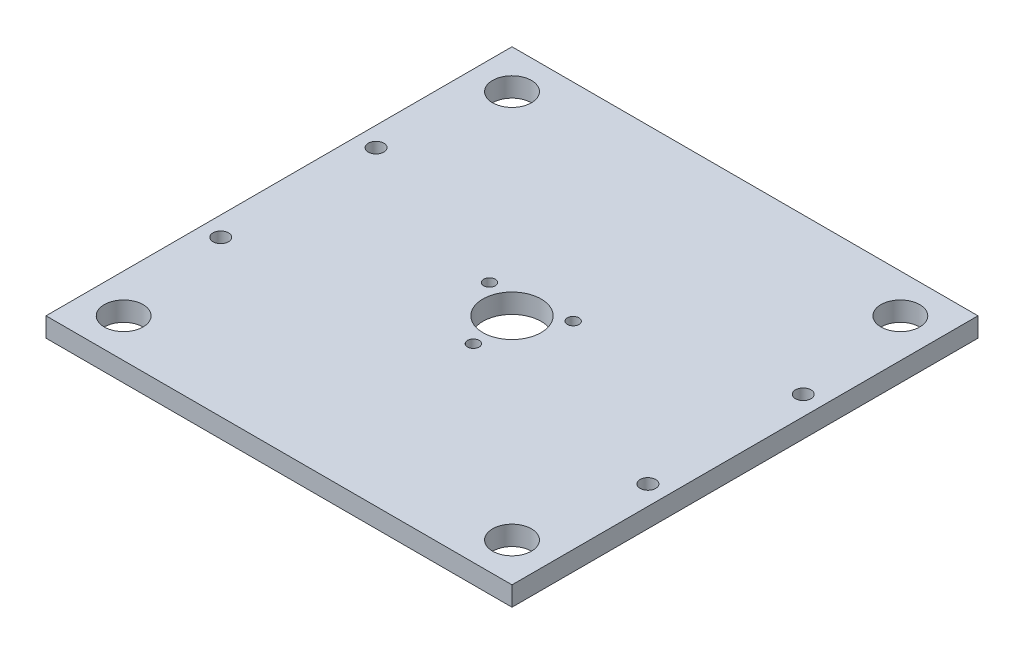
ISO-10303-21;
HEADER;
FILE_DESCRIPTION(('STEP AP214'),'2;1');
FILE_NAME('part.step','',(''),(''),'','','');
FILE_SCHEMA(('AUTOMOTIVE_DESIGN { 1 0 10303 214 1 1 1 1 }'));
ENDSEC;
DATA;
#1=APPLICATION_CONTEXT('core data for automotive mechanical design processes');
#2=APPLICATION_PROTOCOL_DEFINITION('international standard','automotive_design',2000,#1);
#3=PRODUCT_CONTEXT('',#1,'mechanical');
#4=PRODUCT('Part','Part','',(#3));
#5=PRODUCT_RELATED_PRODUCT_CATEGORY('part','',(#4));
#6=PRODUCT_DEFINITION_FORMATION('','',#4);
#7=PRODUCT_DEFINITION_CONTEXT('part definition',#1,'design');
#8=PRODUCT_DEFINITION('design','',#6,#7);
#9=PRODUCT_DEFINITION_SHAPE('','',#8);
#10=(LENGTH_UNIT() NAMED_UNIT(*) SI_UNIT(.MILLI.,.METRE.));
#11=(NAMED_UNIT(*) PLANE_ANGLE_UNIT() SI_UNIT($,.RADIAN.));
#12=(NAMED_UNIT(*) SI_UNIT($,.STERADIAN.) SOLID_ANGLE_UNIT());
#13=UNCERTAINTY_MEASURE_WITH_UNIT(LENGTH_MEASURE(1.E-05),#10,'distance_accuracy_value','');
#14=(GEOMETRIC_REPRESENTATION_CONTEXT(3) GLOBAL_UNCERTAINTY_ASSIGNED_CONTEXT((#13)) GLOBAL_UNIT_ASSIGNED_CONTEXT((#10,
#11,#12)) REPRESENTATION_CONTEXT('',''));
#15=CARTESIAN_POINT('',(0.,0.,0.));
#16=DIRECTION('',(0.,0.,1.));
#17=DIRECTION('',(1.,0.,0.));
#18=AXIS2_PLACEMENT_3D('',#15,#16,#17);
#19=CARTESIAN_POINT('',(0.,6.35,0.));
#20=DIRECTION('',(0.,1.,0.));
#21=DIRECTION('',(0.,0.,1.));
#22=AXIS2_PLACEMENT_3D('',#19,#20,#21);
#23=PLANE('',#22);
#24=CARTESIAN_POINT('',(69.85,6.35,-25.4));
#25=DIRECTION('',(0.,1.,0.));
#26=DIRECTION('',(0.,0.,1.));
#27=AXIS2_PLACEMENT_3D('',#24,#25,#26);
#28=CIRCLE('',#27,2.54);
#29=CARTESIAN_POINT('',(69.85,6.35,-22.86));
#30=VERTEX_POINT('',#29);
#31=EDGE_CURVE('E115',#30,#30,#28,.F.);
#32=ORIENTED_EDGE('',*,*,#31,.T.);
#33=EDGE_LOOP('',(#32));
#34=FACE_BOUND('',#33,.T.);
#35=CARTESIAN_POINT('',(69.85,6.35,25.4));
#36=DIRECTION('',(0.,-1.,0.));
#37=DIRECTION('',(0.,0.,-1.));
#38=AXIS2_PLACEMENT_3D('',#35,#36,#37);
#39=CIRCLE('',#38,2.54);
#40=CARTESIAN_POINT('',(69.85,6.35,22.86));
#41=VERTEX_POINT('',#40);
#42=EDGE_CURVE('E118',#41,#41,#39,.T.);
#43=ORIENTED_EDGE('',*,*,#42,.T.);
#44=EDGE_LOOP('',(#43));
#45=FACE_BOUND('',#44,.T.);
#46=CARTESIAN_POINT('',(-69.85,6.35,-25.4));
#47=DIRECTION('',(0.,-1.,0.));
#48=DIRECTION('',(0.,0.,-1.));
#49=AXIS2_PLACEMENT_3D('',#46,#47,#48);
#50=CIRCLE('',#49,2.54);
#51=CARTESIAN_POINT('',(-69.85,6.35,-27.94));
#52=VERTEX_POINT('',#51);
#53=EDGE_CURVE('E121',#52,#52,#50,.T.);
#54=ORIENTED_EDGE('',*,*,#53,.T.);
#55=EDGE_LOOP('',(#54));
#56=FACE_BOUND('',#55,.T.);
#57=CARTESIAN_POINT('',(-13.1120953434299,6.35,-5.73718467149221));
#58=DIRECTION('',(0.,1.,0.));
#59=DIRECTION('',(0.,0.,1.));
#60=AXIS2_PLACEMENT_3D('',#57,#58,#59);
#61=CIRCLE('',#60,1.89865);
#62=CARTESIAN_POINT('',(-13.1120953434299,6.35,-3.83853467149221));
#63=VERTEX_POINT('',#62);
#64=EDGE_CURVE('E124',#63,#63,#61,.F.);
#65=ORIENTED_EDGE('',*,*,#64,.T.);
#66=EDGE_LOOP('',(#65));
#67=FACE_BOUND('',#66,.T.);
#68=CARTESIAN_POINT('',(11.5245953434299,6.35,-8.4868153285078));
#69=DIRECTION('',(0.,1.,0.));
#70=DIRECTION('',(0.,0.,1.));
#71=AXIS2_PLACEMENT_3D('',#68,#69,#70);
#72=CIRCLE('',#71,1.89865);
#73=CARTESIAN_POINT('',(11.5245953434299,6.35,-6.5881653285078));
#74=VERTEX_POINT('',#73);
#75=EDGE_CURVE('E127',#74,#74,#72,.F.);
#76=ORIENTED_EDGE('',*,*,#75,.T.);
#77=EDGE_LOOP('',(#76));
#78=FACE_BOUND('',#77,.T.);
#79=CARTESIAN_POINT('',(1.5875,6.35,14.224));
#80=DIRECTION('',(0.,1.,0.));
#81=DIRECTION('',(0.,0.,1.));
#82=AXIS2_PLACEMENT_3D('',#79,#80,#81);
#83=CIRCLE('',#82,1.89865);
#84=CARTESIAN_POINT('',(1.5875,6.35,16.12265));
#85=VERTEX_POINT('',#84);
#86=EDGE_CURVE('E130',#85,#85,#83,.F.);
#87=ORIENTED_EDGE('',*,*,#86,.T.);
#88=EDGE_LOOP('',(#87));
#89=FACE_BOUND('',#88,.T.);
#90=CARTESIAN_POINT('',(-69.85,6.35,25.4));
#91=DIRECTION('',(0.,1.,0.));
#92=DIRECTION('',(0.,0.,1.));
#93=AXIS2_PLACEMENT_3D('',#90,#91,#92);
#94=CIRCLE('',#93,2.54);
#95=CARTESIAN_POINT('',(-69.85,6.35,27.94));
#96=VERTEX_POINT('',#95);
#97=EDGE_CURVE('E133',#96,#96,#94,.F.);
#98=ORIENTED_EDGE('',*,*,#97,.T.);
#99=EDGE_LOOP('',(#98));
#100=FACE_BOUND('',#99,.T.);
#101=CARTESIAN_POINT('',(0.,6.35,0.));
#102=DIRECTION('',(0.,1.,0.));
#103=DIRECTION('',(0.,0.,1.));
#104=AXIS2_PLACEMENT_3D('',#101,#102,#103);
#105=CIRCLE('',#104,9.525);
#106=CARTESIAN_POINT('',(0.,6.35,9.525));
#107=VERTEX_POINT('',#106);
#108=EDGE_CURVE('E136',#107,#107,#105,.F.);
#109=ORIENTED_EDGE('',*,*,#108,.T.);
#110=EDGE_LOOP('',(#109));
#111=FACE_BOUND('',#110,.T.);
#112=CARTESIAN_POINT('',(63.5,6.35,-63.5));
#113=DIRECTION('',(0.,1.,0.));
#114=DIRECTION('',(0.,0.,1.));
#115=AXIS2_PLACEMENT_3D('',#112,#113,#114);
#116=CIRCLE('',#115,6.35);
#117=CARTESIAN_POINT('',(63.5,6.35,-57.15));
#118=VERTEX_POINT('',#117);
#119=EDGE_CURVE('E139',#118,#118,#116,.F.);
#120=ORIENTED_EDGE('',*,*,#119,.T.);
#121=EDGE_LOOP('',(#120));
#122=FACE_BOUND('',#121,.T.);
#123=CARTESIAN_POINT('',(63.5,6.35,63.5));
#124=DIRECTION('',(0.,1.,0.));
#125=DIRECTION('',(0.,0.,1.));
#126=AXIS2_PLACEMENT_3D('',#123,#124,#125);
#127=CIRCLE('',#126,6.35);
#128=CARTESIAN_POINT('',(63.5,6.35,69.85));
#129=VERTEX_POINT('',#128);
#130=EDGE_CURVE('E142',#129,#129,#127,.F.);
#131=ORIENTED_EDGE('',*,*,#130,.T.);
#132=EDGE_LOOP('',(#131));
#133=FACE_BOUND('',#132,.T.);
#134=CARTESIAN_POINT('',(-63.5,6.35,63.5));
#135=DIRECTION('',(0.,1.,0.));
#136=DIRECTION('',(0.,0.,1.));
#137=AXIS2_PLACEMENT_3D('',#134,#135,#136);
#138=CIRCLE('',#137,6.35);
#139=CARTESIAN_POINT('',(-63.5,6.35,69.85));
#140=VERTEX_POINT('',#139);
#141=EDGE_CURVE('E144',#140,#140,#138,.F.);
#142=ORIENTED_EDGE('',*,*,#141,.T.);
#143=EDGE_LOOP('',(#142));
#144=FACE_BOUND('',#143,.T.);
#145=CARTESIAN_POINT('',(-63.5,6.35,-63.5));
#146=DIRECTION('',(0.,1.,0.));
#147=DIRECTION('',(0.,0.,1.));
#148=AXIS2_PLACEMENT_3D('',#145,#146,#147);
#149=CIRCLE('',#148,6.35);
#150=CARTESIAN_POINT('',(-63.5,6.35,-57.15));
#151=VERTEX_POINT('',#150);
#152=EDGE_CURVE('E19',#151,#151,#149,.F.);
#153=ORIENTED_EDGE('',*,*,#152,.T.);
#154=EDGE_LOOP('',(#153));
#155=FACE_BOUND('',#154,.T.);
#156=DIRECTION('',(-1.,0.,0.));
#157=VECTOR('',#156,1.);
#158=CARTESIAN_POINT('',(76.2,6.35,-76.2));
#159=LINE('',#158,#157);
#160=CARTESIAN_POINT('',(-76.2,6.35,-76.2));
#161=VERTEX_POINT('',#160);
#162=CARTESIAN_POINT('',(76.2,6.35,-76.2));
#163=VERTEX_POINT('',#162);
#164=EDGE_CURVE('E70',#161,#163,#159,.F.);
#165=ORIENTED_EDGE('',*,*,#164,.F.);
#166=DIRECTION('',(0.,0.,1.));
#167=VECTOR('',#166,1.);
#168=CARTESIAN_POINT('',(-76.2,6.35,-76.2));
#169=LINE('',#168,#167);
#170=CARTESIAN_POINT('',(-76.2,6.35,76.2));
#171=VERTEX_POINT('',#170);
#172=EDGE_CURVE('E67',#171,#161,#169,.F.);
#173=ORIENTED_EDGE('',*,*,#172,.F.);
#174=DIRECTION('',(1.,0.,0.));
#175=VECTOR('',#174,1.);
#176=CARTESIAN_POINT('',(-76.2,6.35,76.2));
#177=LINE('',#176,#175);
#178=CARTESIAN_POINT('',(76.2,6.35,76.2));
#179=VERTEX_POINT('',#178);
#180=EDGE_CURVE('E58',#179,#171,#177,.F.);
#181=ORIENTED_EDGE('',*,*,#180,.F.);
#182=DIRECTION('',(0.,0.,-1.));
#183=VECTOR('',#182,1.);
#184=CARTESIAN_POINT('',(76.2,6.35,76.2));
#185=LINE('',#184,#183);
#186=EDGE_CURVE('E53',#163,#179,#185,.F.);
#187=ORIENTED_EDGE('',*,*,#186,.F.);
#188=EDGE_LOOP('',(#165,#173,#181,#187));
#189=FACE_BOUND('',#188,.T.);
#190=ADVANCED_FACE('F16',(#34,#45,#56,#67,#78,#89,#100,#111,#122,#133,#144,#155,#189),#23,.T.);
#191=CARTESIAN_POINT('',(-76.2,0.,-76.2));
#192=DIRECTION('',(-1.,0.,0.));
#193=DIRECTION('',(0.,0.,1.));
#194=AXIS2_PLACEMENT_3D('',#191,#192,#193);
#195=PLANE('',#194);
#196=DIRECTION('',(0.,1.,0.));
#197=VECTOR('',#196,1.);
#198=CARTESIAN_POINT('',(-76.2,0.,-76.2));
#199=LINE('',#198,#197);
#200=CARTESIAN_POINT('',(-76.2,0.,-76.2));
#201=VERTEX_POINT('',#200);
#202=EDGE_CURVE('E152',#201,#161,#199,.T.);
#203=ORIENTED_EDGE('',*,*,#202,.F.);
#204=DIRECTION('',(0.,0.,1.));
#205=VECTOR('',#204,1.);
#206=CARTESIAN_POINT('',(-76.2,0.,0.));
#207=LINE('',#206,#205);
#208=CARTESIAN_POINT('',(-76.2,0.,76.2));
#209=VERTEX_POINT('',#208);
#210=EDGE_CURVE('E77',#201,#209,#207,.T.);
#211=ORIENTED_EDGE('',*,*,#210,.T.);
#212=DIRECTION('',(0.,1.,0.));
#213=VECTOR('',#212,1.);
#214=CARTESIAN_POINT('',(-76.2,0.,76.2));
#215=LINE('',#214,#213);
#216=EDGE_CURVE('E63',#171,#209,#215,.F.);
#217=ORIENTED_EDGE('',*,*,#216,.F.);
#218=ORIENTED_EDGE('',*,*,#172,.T.);
#219=EDGE_LOOP('',(#203,#211,#217,#218));
#220=FACE_BOUND('',#219,.T.);
#221=ADVANCED_FACE('F76',(#220),#195,.T.);
#222=CARTESIAN_POINT('',(-76.2,0.,76.2));
#223=DIRECTION('',(0.,0.,1.));
#224=DIRECTION('',(1.,0.,0.));
#225=AXIS2_PLACEMENT_3D('',#222,#223,#224);
#226=PLANE('',#225);
#227=ORIENTED_EDGE('',*,*,#216,.T.);
#228=DIRECTION('',(1.,0.,0.));
#229=VECTOR('',#228,1.);
#230=CARTESIAN_POINT('',(0.,0.,76.2));
#231=LINE('',#230,#229);
#232=CARTESIAN_POINT('',(76.2,0.,76.2));
#233=VERTEX_POINT('',#232);
#234=EDGE_CURVE('E163',#209,#233,#231,.T.);
#235=ORIENTED_EDGE('',*,*,#234,.T.);
#236=DIRECTION('',(0.,1.,0.));
#237=VECTOR('',#236,1.);
#238=CARTESIAN_POINT('',(76.2,0.,76.2));
#239=LINE('',#238,#237);
#240=EDGE_CURVE('E65',#179,#233,#239,.F.);
#241=ORIENTED_EDGE('',*,*,#240,.F.);
#242=ORIENTED_EDGE('',*,*,#180,.T.);
#243=EDGE_LOOP('',(#227,#235,#241,#242));
#244=FACE_BOUND('',#243,.T.);
#245=ADVANCED_FACE('F60',(#244),#226,.T.);
#246=CARTESIAN_POINT('',(76.2,0.,76.2));
#247=DIRECTION('',(1.,0.,0.));
#248=DIRECTION('',(0.,0.,-1.));
#249=AXIS2_PLACEMENT_3D('',#246,#247,#248);
#250=PLANE('',#249);
#251=ORIENTED_EDGE('',*,*,#240,.T.);
#252=DIRECTION('',(0.,0.,1.));
#253=VECTOR('',#252,1.);
#254=CARTESIAN_POINT('',(76.2,0.,0.));
#255=LINE('',#254,#253);
#256=CARTESIAN_POINT('',(76.2,0.,-76.2));
#257=VERTEX_POINT('',#256);
#258=EDGE_CURVE('E160',#233,#257,#255,.F.);
#259=ORIENTED_EDGE('',*,*,#258,.T.);
#260=DIRECTION('',(0.,1.,0.));
#261=VECTOR('',#260,1.);
#262=CARTESIAN_POINT('',(76.2,0.,-76.2));
#263=LINE('',#262,#261);
#264=EDGE_CURVE('E34',#163,#257,#263,.F.);
#265=ORIENTED_EDGE('',*,*,#264,.F.);
#266=ORIENTED_EDGE('',*,*,#186,.T.);
#267=EDGE_LOOP('',(#251,#259,#265,#266));
#268=FACE_BOUND('',#267,.T.);
#269=ADVANCED_FACE('F159',(#268),#250,.T.);
#270=CARTESIAN_POINT('',(76.2,0.,-76.2));
#271=DIRECTION('',(0.,0.,-1.));
#272=DIRECTION('',(-1.,0.,0.));
#273=AXIS2_PLACEMENT_3D('',#270,#271,#272);
#274=PLANE('',#273);
#275=ORIENTED_EDGE('',*,*,#264,.T.);
#276=DIRECTION('',(1.,0.,0.));
#277=VECTOR('',#276,1.);
#278=CARTESIAN_POINT('',(0.,0.,-76.2));
#279=LINE('',#278,#277);
#280=EDGE_CURVE('E114',#257,#201,#279,.F.);
#281=ORIENTED_EDGE('',*,*,#280,.T.);
#282=ORIENTED_EDGE('',*,*,#202,.T.);
#283=ORIENTED_EDGE('',*,*,#164,.T.);
#284=EDGE_LOOP('',(#275,#281,#282,#283));
#285=FACE_BOUND('',#284,.T.);
#286=ADVANCED_FACE('F166',(#285),#274,.T.);
#287=CARTESIAN_POINT('',(-63.5,6.35,-63.5));
#288=DIRECTION('',(0.,1.,0.));
#289=DIRECTION('',(0.,0.,1.));
#290=AXIS2_PLACEMENT_3D('',#287,#288,#289);
#291=CYLINDRICAL_SURFACE('',#290,6.35);
#292=ORIENTED_EDGE('',*,*,#152,.F.);
#293=EDGE_LOOP('',(#292));
#294=FACE_BOUND('',#293,.T.);
#295=CARTESIAN_POINT('',(-63.5,0.,-63.5));
#296=DIRECTION('',(0.,1.,0.));
#297=DIRECTION('',(0.,0.,1.));
#298=AXIS2_PLACEMENT_3D('',#295,#296,#297);
#299=CIRCLE('',#298,6.35);
#300=CARTESIAN_POINT('',(-63.5,0.,-57.15));
#301=VERTEX_POINT('',#300);
#302=EDGE_CURVE('E111',#301,#301,#299,.F.);
#303=ORIENTED_EDGE('',*,*,#302,.T.);
#304=EDGE_LOOP('',(#303));
#305=FACE_BOUND('',#304,.T.);
#306=ADVANCED_FACE('F168',(#294,#305),#291,.F.);
#307=CARTESIAN_POINT('',(-63.5,6.35,63.5));
#308=DIRECTION('',(0.,1.,0.));
#309=DIRECTION('',(0.,0.,1.));
#310=AXIS2_PLACEMENT_3D('',#307,#308,#309);
#311=CYLINDRICAL_SURFACE('',#310,6.35);
#312=ORIENTED_EDGE('',*,*,#141,.F.);
#313=EDGE_LOOP('',(#312));
#314=FACE_BOUND('',#313,.T.);
#315=CARTESIAN_POINT('',(-63.5,0.,63.5));
#316=DIRECTION('',(0.,1.,0.));
#317=DIRECTION('',(0.,0.,1.));
#318=AXIS2_PLACEMENT_3D('',#315,#316,#317);
#319=CIRCLE('',#318,6.35);
#320=CARTESIAN_POINT('',(-63.5,0.,69.85));
#321=VERTEX_POINT('',#320);
#322=EDGE_CURVE('E108',#321,#321,#319,.F.);
#323=ORIENTED_EDGE('',*,*,#322,.T.);
#324=EDGE_LOOP('',(#323));
#325=FACE_BOUND('',#324,.T.);
#326=ADVANCED_FACE('F175',(#314,#325),#311,.F.);
#327=CARTESIAN_POINT('',(63.5,6.35,63.5));
#328=DIRECTION('',(0.,1.,0.));
#329=DIRECTION('',(0.,0.,1.));
#330=AXIS2_PLACEMENT_3D('',#327,#328,#329);
#331=CYLINDRICAL_SURFACE('',#330,6.35);
#332=ORIENTED_EDGE('',*,*,#130,.F.);
#333=EDGE_LOOP('',(#332));
#334=FACE_BOUND('',#333,.T.);
#335=CARTESIAN_POINT('',(63.5,0.,63.5));
#336=DIRECTION('',(0.,1.,0.));
#337=DIRECTION('',(0.,0.,1.));
#338=AXIS2_PLACEMENT_3D('',#335,#336,#337);
#339=CIRCLE('',#338,6.35);
#340=CARTESIAN_POINT('',(63.5,0.,69.85));
#341=VERTEX_POINT('',#340);
#342=EDGE_CURVE('E105',#341,#341,#339,.F.);
#343=ORIENTED_EDGE('',*,*,#342,.T.);
#344=EDGE_LOOP('',(#343));
#345=FACE_BOUND('',#344,.T.);
#346=ADVANCED_FACE('F222',(#334,#345),#331,.F.);
#347=CARTESIAN_POINT('',(63.5,6.35,-63.5));
#348=DIRECTION('',(0.,1.,0.));
#349=DIRECTION('',(0.,0.,1.));
#350=AXIS2_PLACEMENT_3D('',#347,#348,#349);
#351=CYLINDRICAL_SURFACE('',#350,6.35);
#352=ORIENTED_EDGE('',*,*,#119,.F.);
#353=EDGE_LOOP('',(#352));
#354=FACE_BOUND('',#353,.T.);
#355=CARTESIAN_POINT('',(63.5,0.,-63.5));
#356=DIRECTION('',(0.,1.,0.));
#357=DIRECTION('',(0.,0.,1.));
#358=AXIS2_PLACEMENT_3D('',#355,#356,#357);
#359=CIRCLE('',#358,6.35);
#360=CARTESIAN_POINT('',(63.5,0.,-57.15));
#361=VERTEX_POINT('',#360);
#362=EDGE_CURVE('E102',#361,#361,#359,.F.);
#363=ORIENTED_EDGE('',*,*,#362,.T.);
#364=EDGE_LOOP('',(#363));
#365=FACE_BOUND('',#364,.T.);
#366=ADVANCED_FACE('F218',(#354,#365),#351,.F.);
#367=CARTESIAN_POINT('',(0.,6.35,0.));
#368=DIRECTION('',(0.,1.,0.));
#369=DIRECTION('',(0.,0.,1.));
#370=AXIS2_PLACEMENT_3D('',#367,#368,#369);
#371=CYLINDRICAL_SURFACE('',#370,9.525);
#372=ORIENTED_EDGE('',*,*,#108,.F.);
#373=EDGE_LOOP('',(#372));
#374=FACE_BOUND('',#373,.T.);
#375=CARTESIAN_POINT('',(0.,0.,0.));
#376=DIRECTION('',(0.,1.,0.));
#377=DIRECTION('',(0.,0.,1.));
#378=AXIS2_PLACEMENT_3D('',#375,#376,#377);
#379=CIRCLE('',#378,9.525);
#380=CARTESIAN_POINT('',(0.,0.,9.525));
#381=VERTEX_POINT('',#380);
#382=EDGE_CURVE('E99',#381,#381,#379,.F.);
#383=ORIENTED_EDGE('',*,*,#382,.T.);
#384=EDGE_LOOP('',(#383));
#385=FACE_BOUND('',#384,.T.);
#386=ADVANCED_FACE('F214',(#374,#385),#371,.F.);
#387=CARTESIAN_POINT('',(-69.85,0.,25.4));
#388=DIRECTION('',(0.,1.,0.));
#389=DIRECTION('',(0.,0.,1.));
#390=AXIS2_PLACEMENT_3D('',#387,#388,#389);
#391=CYLINDRICAL_SURFACE('',#390,2.54);
#392=ORIENTED_EDGE('',*,*,#97,.F.);
#393=EDGE_LOOP('',(#392));
#394=FACE_BOUND('',#393,.T.);
#395=CARTESIAN_POINT('',(-69.85,0.,25.4));
#396=DIRECTION('',(0.,1.,0.));
#397=DIRECTION('',(0.,0.,1.));
#398=AXIS2_PLACEMENT_3D('',#395,#396,#397);
#399=CIRCLE('',#398,2.54);
#400=CARTESIAN_POINT('',(-69.85,0.,27.94));
#401=VERTEX_POINT('',#400);
#402=EDGE_CURVE('E96',#401,#401,#399,.F.);
#403=ORIENTED_EDGE('',*,*,#402,.T.);
#404=EDGE_LOOP('',(#403));
#405=FACE_BOUND('',#404,.T.);
#406=ADVANCED_FACE('F210',(#394,#405),#391,.F.);
#407=CARTESIAN_POINT('',(1.5875,-0.98425,14.224));
#408=DIRECTION('',(0.,1.,0.));
#409=DIRECTION('',(0.,0.,1.));
#410=AXIS2_PLACEMENT_3D('',#407,#408,#409);
#411=CYLINDRICAL_SURFACE('',#410,1.89865);
#412=ORIENTED_EDGE('',*,*,#86,.F.);
#413=EDGE_LOOP('',(#412));
#414=FACE_BOUND('',#413,.T.);
#415=CARTESIAN_POINT('',(1.5875,0.,14.224));
#416=DIRECTION('',(0.,1.,0.));
#417=DIRECTION('',(0.,0.,1.));
#418=AXIS2_PLACEMENT_3D('',#415,#416,#417);
#419=CIRCLE('',#418,1.89865);
#420=CARTESIAN_POINT('',(1.5875,0.,16.12265));
#421=VERTEX_POINT('',#420);
#422=EDGE_CURVE('E93',#421,#421,#419,.F.);
#423=ORIENTED_EDGE('',*,*,#422,.T.);
#424=EDGE_LOOP('',(#423));
#425=FACE_BOUND('',#424,.T.);
#426=ADVANCED_FACE('F206',(#414,#425),#411,.F.);
#427=CARTESIAN_POINT('',(11.5245953434299,-0.984250000000002,-8.4868153285078));
#428=DIRECTION('',(0.,1.,0.));
#429=DIRECTION('',(0.,0.,1.));
#430=AXIS2_PLACEMENT_3D('',#427,#428,#429);
#431=CYLINDRICAL_SURFACE('',#430,1.89865);
#432=ORIENTED_EDGE('',*,*,#75,.F.);
#433=EDGE_LOOP('',(#432));
#434=FACE_BOUND('',#433,.T.);
#435=CARTESIAN_POINT('',(11.5245953434299,0.,-8.4868153285078));
#436=DIRECTION('',(0.,1.,0.));
#437=DIRECTION('',(0.,0.,1.));
#438=AXIS2_PLACEMENT_3D('',#435,#436,#437);
#439=CIRCLE('',#438,1.89865);
#440=CARTESIAN_POINT('',(11.5245953434299,0.,-6.5881653285078));
#441=VERTEX_POINT('',#440);
#442=EDGE_CURVE('E90',#441,#441,#439,.F.);
#443=ORIENTED_EDGE('',*,*,#442,.T.);
#444=EDGE_LOOP('',(#443));
#445=FACE_BOUND('',#444,.T.);
#446=ADVANCED_FACE('F202',(#434,#445),#431,.F.);
#447=CARTESIAN_POINT('',(-13.1120953434299,-0.98425,-5.73718467149221));
#448=DIRECTION('',(0.,1.,0.));
#449=DIRECTION('',(0.,0.,1.));
#450=AXIS2_PLACEMENT_3D('',#447,#448,#449);
#451=CYLINDRICAL_SURFACE('',#450,1.89865);
#452=ORIENTED_EDGE('',*,*,#64,.F.);
#453=EDGE_LOOP('',(#452));
#454=FACE_BOUND('',#453,.T.);
#455=CARTESIAN_POINT('',(-13.1120953434299,0.,-5.73718467149221));
#456=DIRECTION('',(0.,1.,0.));
#457=DIRECTION('',(0.,0.,1.));
#458=AXIS2_PLACEMENT_3D('',#455,#456,#457);
#459=CIRCLE('',#458,1.89865);
#460=CARTESIAN_POINT('',(-13.1120953434299,0.,-3.83853467149221));
#461=VERTEX_POINT('',#460);
#462=EDGE_CURVE('E87',#461,#461,#459,.F.);
#463=ORIENTED_EDGE('',*,*,#462,.T.);
#464=EDGE_LOOP('',(#463));
#465=FACE_BOUND('',#464,.T.);
#466=ADVANCED_FACE('F198',(#454,#465),#451,.F.);
#467=CARTESIAN_POINT('',(-69.85,0.,-25.4));
#468=DIRECTION('',(0.,-1.,0.));
#469=DIRECTION('',(0.,0.,-1.));
#470=AXIS2_PLACEMENT_3D('',#467,#468,#469);
#471=CYLINDRICAL_SURFACE('',#470,2.54);
#472=CARTESIAN_POINT('',(-69.85,0.,-25.4));
#473=DIRECTION('',(0.,-1.,0.));
#474=DIRECTION('',(0.,0.,-1.));
#475=AXIS2_PLACEMENT_3D('',#472,#473,#474);
#476=CIRCLE('',#475,2.54);
#477=CARTESIAN_POINT('',(-69.85,0.,-27.94));
#478=VERTEX_POINT('',#477);
#479=EDGE_CURVE('E84',#478,#478,#476,.T.);
#480=ORIENTED_EDGE('',*,*,#479,.T.);
#481=EDGE_LOOP('',(#480));
#482=FACE_BOUND('',#481,.T.);
#483=ORIENTED_EDGE('',*,*,#53,.F.);
#484=EDGE_LOOP('',(#483));
#485=FACE_BOUND('',#484,.T.);
#486=ADVANCED_FACE('F194',(#482,#485),#471,.F.);
#487=CARTESIAN_POINT('',(69.85,0.,25.4));
#488=DIRECTION('',(0.,-1.,0.));
#489=DIRECTION('',(0.,0.,-1.));
#490=AXIS2_PLACEMENT_3D('',#487,#488,#489);
#491=CYLINDRICAL_SURFACE('',#490,2.54);
#492=CARTESIAN_POINT('',(69.85,0.,25.4));
#493=DIRECTION('',(0.,-1.,0.));
#494=DIRECTION('',(0.,0.,-1.));
#495=AXIS2_PLACEMENT_3D('',#492,#493,#494);
#496=CIRCLE('',#495,2.54);
#497=CARTESIAN_POINT('',(69.85,0.,22.86));
#498=VERTEX_POINT('',#497);
#499=EDGE_CURVE('E25',#498,#498,#496,.T.);
#500=ORIENTED_EDGE('',*,*,#499,.T.);
#501=EDGE_LOOP('',(#500));
#502=FACE_BOUND('',#501,.T.);
#503=ORIENTED_EDGE('',*,*,#42,.F.);
#504=EDGE_LOOP('',(#503));
#505=FACE_BOUND('',#504,.T.);
#506=ADVANCED_FACE('F186',(#502,#505),#491,.F.);
#507=CARTESIAN_POINT('',(69.85,0.,-25.4));
#508=DIRECTION('',(0.,1.,0.));
#509=DIRECTION('',(0.,0.,1.));
#510=AXIS2_PLACEMENT_3D('',#507,#508,#509);
#511=CYLINDRICAL_SURFACE('',#510,2.54);
#512=ORIENTED_EDGE('',*,*,#31,.F.);
#513=EDGE_LOOP('',(#512));
#514=FACE_BOUND('',#513,.T.);
#515=CARTESIAN_POINT('',(69.85,0.,-25.4));
#516=DIRECTION('',(0.,1.,0.));
#517=DIRECTION('',(0.,0.,1.));
#518=AXIS2_PLACEMENT_3D('',#515,#516,#517);
#519=CIRCLE('',#518,2.54);
#520=CARTESIAN_POINT('',(69.85,0.,-22.86));
#521=VERTEX_POINT('',#520);
#522=EDGE_CURVE('E11',#521,#521,#519,.F.);
#523=ORIENTED_EDGE('',*,*,#522,.T.);
#524=EDGE_LOOP('',(#523));
#525=FACE_BOUND('',#524,.T.);
#526=ADVANCED_FACE('F180',(#514,#525),#511,.F.);
#527=CARTESIAN_POINT('',(0.,0.,0.));
#528=DIRECTION('',(0.,1.,0.));
#529=DIRECTION('',(0.,0.,1.));
#530=AXIS2_PLACEMENT_3D('',#527,#528,#529);
#531=PLANE('',#530);
#532=ORIENTED_EDGE('',*,*,#522,.F.);
#533=EDGE_LOOP('',(#532));
#534=FACE_BOUND('',#533,.T.);
#535=ORIENTED_EDGE('',*,*,#499,.F.);
#536=EDGE_LOOP('',(#535));
#537=FACE_BOUND('',#536,.T.);
#538=ORIENTED_EDGE('',*,*,#479,.F.);
#539=EDGE_LOOP('',(#538));
#540=FACE_BOUND('',#539,.T.);
#541=ORIENTED_EDGE('',*,*,#462,.F.);
#542=EDGE_LOOP('',(#541));
#543=FACE_BOUND('',#542,.T.);
#544=ORIENTED_EDGE('',*,*,#442,.F.);
#545=EDGE_LOOP('',(#544));
#546=FACE_BOUND('',#545,.T.);
#547=ORIENTED_EDGE('',*,*,#422,.F.);
#548=EDGE_LOOP('',(#547));
#549=FACE_BOUND('',#548,.T.);
#550=ORIENTED_EDGE('',*,*,#402,.F.);
#551=EDGE_LOOP('',(#550));
#552=FACE_BOUND('',#551,.T.);
#553=ORIENTED_EDGE('',*,*,#382,.F.);
#554=EDGE_LOOP('',(#553));
#555=FACE_BOUND('',#554,.T.);
#556=ORIENTED_EDGE('',*,*,#362,.F.);
#557=EDGE_LOOP('',(#556));
#558=FACE_BOUND('',#557,.T.);
#559=ORIENTED_EDGE('',*,*,#342,.F.);
#560=EDGE_LOOP('',(#559));
#561=FACE_BOUND('',#560,.T.);
#562=ORIENTED_EDGE('',*,*,#322,.F.);
#563=EDGE_LOOP('',(#562));
#564=FACE_BOUND('',#563,.T.);
#565=ORIENTED_EDGE('',*,*,#302,.F.);
#566=EDGE_LOOP('',(#565));
#567=FACE_BOUND('',#566,.T.);
#568=ORIENTED_EDGE('',*,*,#258,.F.);
#569=ORIENTED_EDGE('',*,*,#234,.F.);
#570=ORIENTED_EDGE('',*,*,#210,.F.);
#571=ORIENTED_EDGE('',*,*,#280,.F.);
#572=EDGE_LOOP('',(#568,#569,#570,#571));
#573=FACE_BOUND('',#572,.T.);
#574=ADVANCED_FACE('F162',(#534,#537,#540,#543,#546,#549,#552,#555,#558,#561,#564,#567,#573),
#531,.F.);
#575=CLOSED_SHELL('',(#190,#221,#245,#269,#286,#306,#326,#346,#366,#386,#406,#426,#446,#466,
#486,#506,#526,#574));
#576=MANIFOLD_SOLID_BREP('B1',#575);
#577=ADVANCED_BREP_SHAPE_REPRESENTATION('',(#18,#576),#14);
#578=SHAPE_DEFINITION_REPRESENTATION(#9,#577);
ENDSEC;
END-ISO-10303-21;
